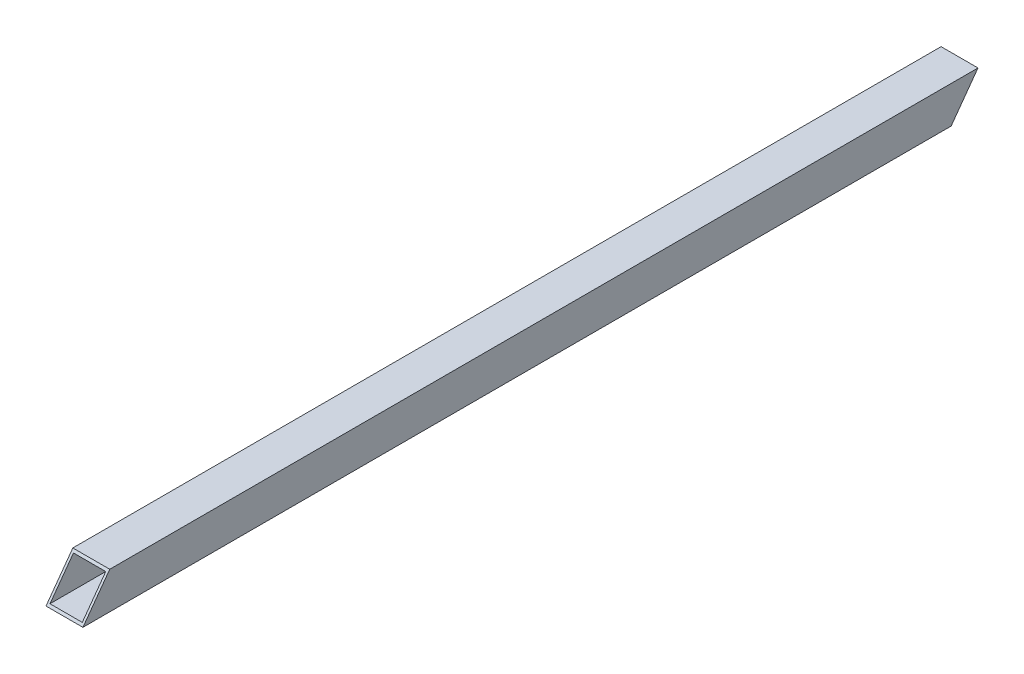
ISO-10303-21;
HEADER;
FILE_DESCRIPTION(('STEP AP214'),'2;1');
FILE_NAME('part.step','',(''),(''),'','','');
FILE_SCHEMA(('AUTOMOTIVE_DESIGN { 1 0 10303 214 1 1 1 1 }'));
ENDSEC;
DATA;
#1=APPLICATION_CONTEXT('core data for automotive mechanical design processes');
#2=APPLICATION_PROTOCOL_DEFINITION('international standard','automotive_design',2000,#1);
#3=PRODUCT_CONTEXT('',#1,'mechanical');
#4=PRODUCT('Part','Part','',(#3));
#5=PRODUCT_RELATED_PRODUCT_CATEGORY('part','',(#4));
#6=PRODUCT_DEFINITION_FORMATION('','',#4);
#7=PRODUCT_DEFINITION_CONTEXT('part definition',#1,'design');
#8=PRODUCT_DEFINITION('design','',#6,#7);
#9=PRODUCT_DEFINITION_SHAPE('','',#8);
#10=(LENGTH_UNIT() NAMED_UNIT(*) SI_UNIT(.MILLI.,.METRE.));
#11=(NAMED_UNIT(*) PLANE_ANGLE_UNIT() SI_UNIT($,.RADIAN.));
#12=(NAMED_UNIT(*) SI_UNIT($,.STERADIAN.) SOLID_ANGLE_UNIT());
#13=UNCERTAINTY_MEASURE_WITH_UNIT(LENGTH_MEASURE(1.E-05),#10,'distance_accuracy_value','');
#14=(GEOMETRIC_REPRESENTATION_CONTEXT(3) GLOBAL_UNCERTAINTY_ASSIGNED_CONTEXT((#13)) GLOBAL_UNIT_ASSIGNED_CONTEXT((#10,
#11,#12)) REPRESENTATION_CONTEXT('',''));
#15=CARTESIAN_POINT('',(0.,0.,0.));
#16=DIRECTION('',(0.,0.,1.));
#17=DIRECTION('',(1.,0.,0.));
#18=AXIS2_PLACEMENT_3D('',#15,#16,#17);
#19=CARTESIAN_POINT('',(25.4,-25.4,1231.9));
#20=DIRECTION('',(-1.,0.,0.));
#21=DIRECTION('',(0.,0.,1.));
#22=AXIS2_PLACEMENT_3D('',#19,#20,#21);
#23=PLANE('',#22);
#24=DIRECTION('',(0.,0.809016994374944,-0.587785252292477));
#25=VECTOR('',#24,1.);
#26=CARTESIAN_POINT('',(25.4,-25.4,1231.9));
#27=LINE('',#26,#25);
#28=CARTESIAN_POINT('',(25.4,-25.4,1231.9));
#29=VERTEX_POINT('',#28);
#30=CARTESIAN_POINT('',(25.4,25.4,1194.99163957733));
#31=VERTEX_POINT('',#30);
#32=EDGE_CURVE('E99',#29,#31,#27,.T.);
#33=ORIENTED_EDGE('',*,*,#32,.F.);
#34=DIRECTION('',(0.,0.,-1.));
#35=VECTOR('',#34,1.);
#36=CARTESIAN_POINT('',(25.4,-25.4,1231.9));
#37=LINE('',#36,#35);
#38=CARTESIAN_POINT('',(25.4,-25.4,36.9083604226728));
#39=VERTEX_POINT('',#38);
#40=EDGE_CURVE('E107',#29,#39,#37,.T.);
#41=ORIENTED_EDGE('',*,*,#40,.T.);
#42=DIRECTION('',(0.,0.809016994374944,-0.587785252292477));
#43=VECTOR('',#42,1.);
#44=CARTESIAN_POINT('',(25.4,25.4,0.));
#45=LINE('',#44,#43);
#46=CARTESIAN_POINT('',(25.4,25.4,0.));
#47=VERTEX_POINT('',#46);
#48=EDGE_CURVE('E54',#39,#47,#45,.T.);
#49=ORIENTED_EDGE('',*,*,#48,.T.);
#50=DIRECTION('',(0.,0.,-1.));
#51=VECTOR('',#50,1.);
#52=CARTESIAN_POINT('',(25.4,25.4,1231.9));
#53=LINE('',#52,#51);
#54=EDGE_CURVE('E113',#31,#47,#53,.T.);
#55=ORIENTED_EDGE('',*,*,#54,.F.);
#56=EDGE_LOOP('',(#33,#41,#49,#55));
#57=FACE_BOUND('',#56,.T.);
#58=ADVANCED_FACE('F33',(#57),#23,.F.);
#59=CARTESIAN_POINT('',(-25.4,25.4,1231.9));
#60=DIRECTION('',(0.,-1.,0.));
#61=DIRECTION('',(0.,0.,-1.));
#62=AXIS2_PLACEMENT_3D('',#59,#60,#61);
#63=PLANE('',#62);
#64=DIRECTION('',(-1.,0.,0.));
#65=VECTOR('',#64,1.);
#66=CARTESIAN_POINT('',(25.4,25.4,1194.99163957733));
#67=LINE('',#66,#65);
#68=CARTESIAN_POINT('',(-25.4,25.4,1194.99163957733));
#69=VERTEX_POINT('',#68);
#70=EDGE_CURVE('E114',#31,#69,#67,.T.);
#71=ORIENTED_EDGE('',*,*,#70,.F.);
#72=ORIENTED_EDGE('',*,*,#54,.T.);
#73=DIRECTION('',(-1.,0.,0.));
#74=VECTOR('',#73,1.);
#75=CARTESIAN_POINT('',(-25.4,25.4,0.));
#76=LINE('',#75,#74);
#77=CARTESIAN_POINT('',(-25.4,25.4,0.));
#78=VERTEX_POINT('',#77);
#79=EDGE_CURVE('E108',#47,#78,#76,.T.);
#80=ORIENTED_EDGE('',*,*,#79,.T.);
#81=DIRECTION('',(0.,0.,-1.));
#82=VECTOR('',#81,1.);
#83=CARTESIAN_POINT('',(-25.4,25.4,1231.9));
#84=LINE('',#83,#82);
#85=EDGE_CURVE('E120',#69,#78,#84,.T.);
#86=ORIENTED_EDGE('',*,*,#85,.F.);
#87=EDGE_LOOP('',(#71,#72,#80,#86));
#88=FACE_BOUND('',#87,.T.);
#89=ADVANCED_FACE('F158',(#88),#63,.F.);
#90=CARTESIAN_POINT('',(-25.4,-25.4,1231.9));
#91=DIRECTION('',(1.,0.,0.));
#92=DIRECTION('',(0.,0.,-1.));
#93=AXIS2_PLACEMENT_3D('',#90,#91,#92);
#94=PLANE('',#93);
#95=DIRECTION('',(0.,0.809016994374944,-0.587785252292477));
#96=VECTOR('',#95,1.);
#97=CARTESIAN_POINT('',(-25.4,-25.4,1231.9));
#98=LINE('',#97,#96);
#99=CARTESIAN_POINT('',(-25.4,-25.4,1231.9));
#100=VERTEX_POINT('',#99);
#101=EDGE_CURVE('E102',#100,#69,#98,.T.);
#102=ORIENTED_EDGE('',*,*,#101,.T.);
#103=ORIENTED_EDGE('',*,*,#85,.T.);
#104=DIRECTION('',(0.,0.809016994374944,-0.587785252292477));
#105=VECTOR('',#104,1.);
#106=CARTESIAN_POINT('',(-25.4,25.4,0.));
#107=LINE('',#106,#105);
#108=CARTESIAN_POINT('',(-25.4,-25.4,36.9083604226728));
#109=VERTEX_POINT('',#108);
#110=EDGE_CURVE('E161',#109,#78,#107,.T.);
#111=ORIENTED_EDGE('',*,*,#110,.F.);
#112=DIRECTION('',(0.,0.,-1.));
#113=VECTOR('',#112,1.);
#114=CARTESIAN_POINT('',(-25.4,-25.4,1231.9));
#115=LINE('',#114,#113);
#116=EDGE_CURVE('E118',#100,#109,#115,.T.);
#117=ORIENTED_EDGE('',*,*,#116,.F.);
#118=EDGE_LOOP('',(#102,#103,#111,#117));
#119=FACE_BOUND('',#118,.T.);
#120=ADVANCED_FACE('F175',(#119),#94,.F.);
#121=CARTESIAN_POINT('',(22.225,-22.225,1231.9));
#122=DIRECTION('',(-1.,0.,0.));
#123=DIRECTION('',(0.,0.,1.));
#124=AXIS2_PLACEMENT_3D('',#121,#122,#123);
#125=PLANE('',#124);
#126=DIRECTION('',(0.,0.,-1.));
#127=VECTOR('',#126,1.);
#128=CARTESIAN_POINT('',(22.225,-22.225,1231.9));
#129=LINE('',#128,#127);
#130=CARTESIAN_POINT('',(22.225,-22.225,1229.59322747358));
#131=VERTEX_POINT('',#130);
#132=CARTESIAN_POINT('',(22.225,-22.225,34.6015878962558));
#133=VERTEX_POINT('',#132);
#134=EDGE_CURVE('E142',#131,#133,#129,.T.);
#135=ORIENTED_EDGE('',*,*,#134,.F.);
#136=DIRECTION('',(0.,0.809016994374944,-0.587785252292478));
#137=VECTOR('',#136,1.);
#138=CARTESIAN_POINT('',(22.225,-23.3219355214298,1230.39019778038));
#139=LINE('',#138,#137);
#140=CARTESIAN_POINT('',(22.225,22.225,1197.29841210374));
#141=VERTEX_POINT('',#140);
#142=EDGE_CURVE('E47',#131,#141,#139,.T.);
#143=ORIENTED_EDGE('',*,*,#142,.T.);
#144=DIRECTION('',(0.,0.,-1.));
#145=VECTOR('',#144,1.);
#146=CARTESIAN_POINT('',(22.225,22.225,1231.9));
#147=LINE('',#146,#145);
#148=CARTESIAN_POINT('',(22.225,22.225,2.3067725264172));
#149=VERTEX_POINT('',#148);
#150=EDGE_CURVE('E144',#141,#149,#147,.T.);
#151=ORIENTED_EDGE('',*,*,#150,.T.);
#152=DIRECTION('',(0.,0.809016994374944,-0.587785252292478));
#153=VECTOR('',#152,1.);
#154=CARTESIAN_POINT('',(22.225,-591.574228390555,448.258015609036));
#155=LINE('',#154,#153);
#156=EDGE_CURVE('E133',#133,#149,#155,.T.);
#157=ORIENTED_EDGE('',*,*,#156,.F.);
#158=EDGE_LOOP('',(#135,#143,#151,#157));
#159=FACE_BOUND('',#158,.T.);
#160=ADVANCED_FACE('F141',(#159),#125,.T.);
#161=CARTESIAN_POINT('',(-22.225,22.225,1231.9));
#162=DIRECTION('',(0.,-1.,0.));
#163=DIRECTION('',(0.,0.,-1.));
#164=AXIS2_PLACEMENT_3D('',#161,#162,#163);
#165=PLANE('',#164);
#166=ORIENTED_EDGE('',*,*,#150,.F.);
#167=DIRECTION('',(-1.,0.,0.));
#168=VECTOR('',#167,1.);
#169=CARTESIAN_POINT('',(-22.225,22.225,1197.29841210374));
#170=LINE('',#169,#168);
#171=CARTESIAN_POINT('',(-22.225,22.225,1197.29841210374));
#172=VERTEX_POINT('',#171);
#173=EDGE_CURVE('E167',#141,#172,#170,.T.);
#174=ORIENTED_EDGE('',*,*,#173,.T.);
#175=DIRECTION('',(0.,0.,-1.));
#176=VECTOR('',#175,1.);
#177=CARTESIAN_POINT('',(-22.225,22.225,1231.9));
#178=LINE('',#177,#176);
#179=CARTESIAN_POINT('',(-22.225,22.2250000000001,2.30677252641726));
#180=VERTEX_POINT('',#179);
#181=EDGE_CURVE('E153',#172,#180,#178,.T.);
#182=ORIENTED_EDGE('',*,*,#181,.T.);
#183=DIRECTION('',(-1.,0.,0.));
#184=VECTOR('',#183,1.);
#185=CARTESIAN_POINT('',(-22.225,22.225,2.3067725264172));
#186=LINE('',#185,#184);
#187=EDGE_CURVE('E145',#149,#180,#186,.T.);
#188=ORIENTED_EDGE('',*,*,#187,.F.);
#189=EDGE_LOOP('',(#166,#174,#182,#188));
#190=FACE_BOUND('',#189,.T.);
#191=ADVANCED_FACE('F182',(#190),#165,.T.);
#192=CARTESIAN_POINT('',(-22.225,-22.225,1231.9));
#193=DIRECTION('',(1.,0.,0.));
#194=DIRECTION('',(0.,0.,-1.));
#195=AXIS2_PLACEMENT_3D('',#192,#193,#194);
#196=PLANE('',#195);
#197=ORIENTED_EDGE('',*,*,#181,.F.);
#198=DIRECTION('',(0.,-0.809016994374944,0.587785252292478));
#199=VECTOR('',#198,1.);
#200=CARTESIAN_POINT('',(-22.225,-23.3219355214298,1230.39019778038));
#201=LINE('',#200,#199);
#202=CARTESIAN_POINT('',(-22.225,-22.225,1229.59322747358));
#203=VERTEX_POINT('',#202);
#204=EDGE_CURVE('E170',#172,#203,#201,.T.);
#205=ORIENTED_EDGE('',*,*,#204,.T.);
#206=DIRECTION('',(0.,0.,-1.));
#207=VECTOR('',#206,1.);
#208=CARTESIAN_POINT('',(-22.225,-22.225,1231.9));
#209=LINE('',#208,#207);
#210=CARTESIAN_POINT('',(-22.225,-22.225,34.6015878962558));
#211=VERTEX_POINT('',#210);
#212=EDGE_CURVE('E147',#203,#211,#209,.T.);
#213=ORIENTED_EDGE('',*,*,#212,.T.);
#214=DIRECTION('',(0.,-0.809016994374944,0.587785252292478));
#215=VECTOR('',#214,1.);
#216=CARTESIAN_POINT('',(-22.225,-591.574228390555,448.258015609036));
#217=LINE('',#216,#215);
#218=EDGE_CURVE('E136',#180,#211,#217,.T.);
#219=ORIENTED_EDGE('',*,*,#218,.F.);
#220=EDGE_LOOP('',(#197,#205,#213,#219));
#221=FACE_BOUND('',#220,.T.);
#222=ADVANCED_FACE('F212',(#221),#196,.T.);
#223=CARTESIAN_POINT('',(-22.225,-22.225,1231.9));
#224=DIRECTION('',(0.,1.,0.));
#225=DIRECTION('',(0.,0.,1.));
#226=AXIS2_PLACEMENT_3D('',#223,#224,#225);
#227=PLANE('',#226);
#228=ORIENTED_EDGE('',*,*,#212,.F.);
#229=DIRECTION('',(1.,0.,0.));
#230=VECTOR('',#229,1.);
#231=CARTESIAN_POINT('',(-22.225,-22.225,1229.59322747358));
#232=LINE('',#231,#230);
#233=EDGE_CURVE('E11',#203,#131,#232,.T.);
#234=ORIENTED_EDGE('',*,*,#233,.T.);
#235=ORIENTED_EDGE('',*,*,#134,.T.);
#236=DIRECTION('',(1.,0.,0.));
#237=VECTOR('',#236,1.);
#238=CARTESIAN_POINT('',(-22.225,-22.225,34.6015878962558));
#239=LINE('',#238,#237);
#240=EDGE_CURVE('E40',#211,#133,#239,.T.);
#241=ORIENTED_EDGE('',*,*,#240,.F.);
#242=EDGE_LOOP('',(#228,#234,#235,#241));
#243=FACE_BOUND('',#242,.T.);
#244=ADVANCED_FACE('F222',(#243),#227,.T.);
#245=CARTESIAN_POINT('',(-25.4,-25.4,1231.9));
#246=DIRECTION('',(0.,1.,0.));
#247=DIRECTION('',(0.,0.,1.));
#248=AXIS2_PLACEMENT_3D('',#245,#246,#247);
#249=PLANE('',#248);
#250=ORIENTED_EDGE('',*,*,#116,.T.);
#251=DIRECTION('',(-1.,0.,0.));
#252=VECTOR('',#251,1.);
#253=CARTESIAN_POINT('',(25.4,-25.4,36.9083604226728));
#254=LINE('',#253,#252);
#255=EDGE_CURVE('E117',#39,#109,#254,.T.);
#256=ORIENTED_EDGE('',*,*,#255,.F.);
#257=ORIENTED_EDGE('',*,*,#40,.F.);
#258=DIRECTION('',(1.,0.,0.));
#259=VECTOR('',#258,1.);
#260=CARTESIAN_POINT('',(-25.4,-25.4,1231.9));
#261=LINE('',#260,#259);
#262=EDGE_CURVE('E96',#100,#29,#261,.T.);
#263=ORIENTED_EDGE('',*,*,#262,.F.);
#264=EDGE_LOOP('',(#250,#256,#257,#263));
#265=FACE_BOUND('',#264,.T.);
#266=ADVANCED_FACE('F116',(#265),#249,.F.);
#267=CARTESIAN_POINT('',(25.4,25.4,0.));
#268=DIRECTION('',(0.,0.587785252292477,0.809016994374944));
#269=DIRECTION('',(0.,-0.809016994374944,0.587785252292478));
#270=AXIS2_PLACEMENT_3D('',#267,#268,#269);
#271=PLANE('',#270);
#272=ORIENTED_EDGE('',*,*,#156,.T.);
#273=ORIENTED_EDGE('',*,*,#187,.T.);
#274=ORIENTED_EDGE('',*,*,#218,.T.);
#275=ORIENTED_EDGE('',*,*,#240,.T.);
#276=EDGE_LOOP('',(#272,#273,#274,#275));
#277=FACE_BOUND('',#276,.T.);
#278=ORIENTED_EDGE('',*,*,#110,.T.);
#279=ORIENTED_EDGE('',*,*,#79,.F.);
#280=ORIENTED_EDGE('',*,*,#48,.F.);
#281=ORIENTED_EDGE('',*,*,#255,.T.);
#282=EDGE_LOOP('',(#278,#279,#280,#281));
#283=FACE_BOUND('',#282,.T.);
#284=ADVANCED_FACE('F131',(#277,#283),#271,.F.);
#285=CARTESIAN_POINT('',(25.4,-25.4,1231.9));
#286=DIRECTION('',(0.,0.587785252292477,0.809016994374944));
#287=DIRECTION('',(0.,-0.809016994374944,0.587785252292478));
#288=AXIS2_PLACEMENT_3D('',#285,#286,#287);
#289=PLANE('',#288);
#290=ORIENTED_EDGE('',*,*,#233,.F.);
#291=ORIENTED_EDGE('',*,*,#204,.F.);
#292=ORIENTED_EDGE('',*,*,#173,.F.);
#293=ORIENTED_EDGE('',*,*,#142,.F.);
#294=EDGE_LOOP('',(#290,#291,#292,#293));
#295=FACE_BOUND('',#294,.T.);
#296=ORIENTED_EDGE('',*,*,#101,.F.);
#297=ORIENTED_EDGE('',*,*,#262,.T.);
#298=ORIENTED_EDGE('',*,*,#32,.T.);
#299=ORIENTED_EDGE('',*,*,#70,.T.);
#300=EDGE_LOOP('',(#296,#297,#298,#299));
#301=FACE_BOUND('',#300,.T.);
#302=ADVANCED_FACE('F98',(#295,#301),#289,.T.);
#303=CLOSED_SHELL('',(#58,#89,#120,#160,#191,#222,#244,#266,#284,#302));
#304=MANIFOLD_SOLID_BREP('B2',#303);
#305=ADVANCED_BREP_SHAPE_REPRESENTATION('',(#18,#304),#14);
#306=SHAPE_DEFINITION_REPRESENTATION(#9,#305);
ENDSEC;
END-ISO-10303-21;
